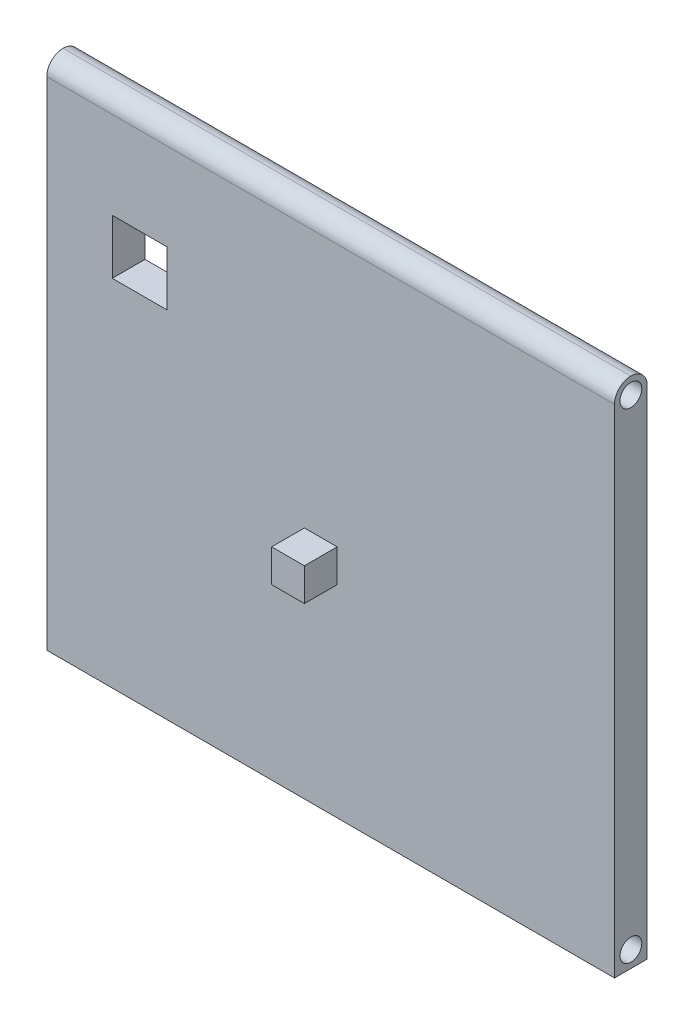
ISO-10303-21;
HEADER;
FILE_DESCRIPTION(('STEP AP214'),'2;1');
FILE_NAME('part.step','',(''),(''),'','','');
FILE_SCHEMA(('AUTOMOTIVE_DESIGN { 1 0 10303 214 1 1 1 1 }'));
ENDSEC;
DATA;
#1=APPLICATION_CONTEXT('core data for automotive mechanical design processes');
#2=APPLICATION_PROTOCOL_DEFINITION('international standard','automotive_design',2000,#1);
#3=PRODUCT_CONTEXT('',#1,'mechanical');
#4=PRODUCT('Part','Part','',(#3));
#5=PRODUCT_RELATED_PRODUCT_CATEGORY('part','',(#4));
#6=PRODUCT_DEFINITION_FORMATION('','',#4);
#7=PRODUCT_DEFINITION_CONTEXT('part definition',#1,'design');
#8=PRODUCT_DEFINITION('design','',#6,#7);
#9=PRODUCT_DEFINITION_SHAPE('','',#8);
#10=(LENGTH_UNIT() NAMED_UNIT(*) SI_UNIT(.MILLI.,.METRE.));
#11=(NAMED_UNIT(*) PLANE_ANGLE_UNIT() SI_UNIT($,.RADIAN.));
#12=(NAMED_UNIT(*) SI_UNIT($,.STERADIAN.) SOLID_ANGLE_UNIT());
#13=UNCERTAINTY_MEASURE_WITH_UNIT(LENGTH_MEASURE(1.E-05),#10,'distance_accuracy_value','');
#14=(GEOMETRIC_REPRESENTATION_CONTEXT(3) GLOBAL_UNCERTAINTY_ASSIGNED_CONTEXT((#13)) GLOBAL_UNIT_ASSIGNED_CONTEXT((#10,
#11,#12)) REPRESENTATION_CONTEXT('',''));
#15=CARTESIAN_POINT('',(0.,0.,0.));
#16=DIRECTION('',(0.,0.,1.));
#17=DIRECTION('',(1.,0.,0.));
#18=AXIS2_PLACEMENT_3D('',#15,#16,#17);
#19=CARTESIAN_POINT('',(0.,0.,3.));
#20=DIRECTION('',(0.,0.,1.));
#21=DIRECTION('',(1.,0.,0.));
#22=AXIS2_PLACEMENT_3D('',#19,#20,#21);
#23=PLANE('',#22);
#24=DIRECTION('',(0.,1.,0.));
#25=VECTOR('',#24,1.);
#26=CARTESIAN_POINT('',(-5.47328244274809,0.,3.));
#27=LINE('',#26,#25);
#28=CARTESIAN_POINT('',(-5.47328244274809,-7.2557251908397,3.));
#29=VERTEX_POINT('',#28);
#30=CARTESIAN_POINT('',(-5.47328244274809,-2.2557251908397,3.));
#31=VERTEX_POINT('',#30);
#32=EDGE_CURVE('E178',#29,#31,#27,.T.);
#33=ORIENTED_EDGE('',*,*,#32,.F.);
#34=DIRECTION('',(1.,0.,0.));
#35=VECTOR('',#34,1.);
#36=CARTESIAN_POINT('',(0.,-7.2557251908397,3.));
#37=LINE('',#36,#35);
#38=CARTESIAN_POINT('',(-10.4732824427481,-7.2557251908397,3.));
#39=VERTEX_POINT('',#38);
#40=EDGE_CURVE('E166',#39,#29,#37,.T.);
#41=ORIENTED_EDGE('',*,*,#40,.F.);
#42=DIRECTION('',(0.,-1.,0.));
#43=VECTOR('',#42,1.);
#44=CARTESIAN_POINT('',(-10.4732824427481,0.,3.));
#45=LINE('',#44,#43);
#46=CARTESIAN_POINT('',(-10.4732824427481,-2.2557251908397,3.));
#47=VERTEX_POINT('',#46);
#48=EDGE_CURVE('E141',#47,#39,#45,.T.);
#49=ORIENTED_EDGE('',*,*,#48,.F.);
#50=DIRECTION('',(-1.,0.,0.));
#51=VECTOR('',#50,1.);
#52=CARTESIAN_POINT('',(0.,-2.2557251908397,3.));
#53=LINE('',#52,#51);
#54=EDGE_CURVE('E175',#31,#47,#53,.T.);
#55=ORIENTED_EDGE('',*,*,#54,.F.);
#56=EDGE_LOOP('',(#33,#41,#49,#55));
#57=FACE_BOUND('',#56,.T.);
#58=DIRECTION('',(0.,1.,0.));
#59=VECTOR('',#58,1.);
#60=CARTESIAN_POINT('',(35.5267175572519,7.2442748091603,3.));
#61=LINE('',#60,#59);
#62=CARTESIAN_POINT('',(35.5267175572519,-39.7557251908397,3.));
#63=VERTEX_POINT('',#62);
#64=CARTESIAN_POINT('',(35.5267175572519,5.7442748091603,3.));
#65=VERTEX_POINT('',#64);
#66=EDGE_CURVE('E246',#63,#65,#61,.T.);
#67=ORIENTED_EDGE('',*,*,#66,.T.);
#68=DIRECTION('',(-1.,0.,0.));
#69=VECTOR('',#68,1.);
#70=CARTESIAN_POINT('',(-16.4732824427481,5.7442748091603,3.));
#71=LINE('',#70,#69);
#72=CARTESIAN_POINT('',(-16.4732824427481,5.7442748091603,3.));
#73=VERTEX_POINT('',#72);
#74=EDGE_CURVE('E279',#65,#73,#71,.T.);
#75=ORIENTED_EDGE('',*,*,#74,.T.);
#76=DIRECTION('',(0.,-1.,0.));
#77=VECTOR('',#76,1.);
#78=CARTESIAN_POINT('',(-16.4732824427481,7.2442748091603,3.));
#79=LINE('',#78,#77);
#80=CARTESIAN_POINT('',(-16.4732824427481,-39.7557251908397,3.));
#81=VERTEX_POINT('',#80);
#82=EDGE_CURVE('E239',#73,#81,#79,.T.);
#83=ORIENTED_EDGE('',*,*,#82,.T.);
#84=DIRECTION('',(1.,0.,0.));
#85=VECTOR('',#84,1.);
#86=CARTESIAN_POINT('',(-16.4732824427481,-39.7557251908397,3.));
#87=LINE('',#86,#85);
#88=EDGE_CURVE('E242',#81,#63,#87,.T.);
#89=ORIENTED_EDGE('',*,*,#88,.T.);
#90=EDGE_LOOP('',(#67,#75,#83,#89));
#91=FACE_BOUND('',#90,.T.);
#92=DIRECTION('',(1.,0.,0.));
#93=VECTOR('',#92,1.);
#94=CARTESIAN_POINT('',(7.12671755725191,-21.2557251908397,3.));
#95=LINE('',#94,#93);
#96=CARTESIAN_POINT('',(7.12671755725191,-21.2557251908397,3.));
#97=VERTEX_POINT('',#96);
#98=CARTESIAN_POINT('',(10.1267175572519,-21.2557251908397,3.));
#99=VERTEX_POINT('',#98);
#100=EDGE_CURVE('E200',#97,#99,#95,.T.);
#101=ORIENTED_EDGE('',*,*,#100,.F.);
#102=DIRECTION('',(0.,-1.,0.));
#103=VECTOR('',#102,1.);
#104=CARTESIAN_POINT('',(7.12671755725191,-18.2557251908397,3.));
#105=LINE('',#104,#103);
#106=CARTESIAN_POINT('',(7.12671755725191,-18.2557251908397,3.));
#107=VERTEX_POINT('',#106);
#108=EDGE_CURVE('E181',#107,#97,#105,.T.);
#109=ORIENTED_EDGE('',*,*,#108,.F.);
#110=DIRECTION('',(-1.,0.,0.));
#111=VECTOR('',#110,1.);
#112=CARTESIAN_POINT('',(7.12671755725191,-18.2557251908397,3.));
#113=LINE('',#112,#111);
#114=CARTESIAN_POINT('',(10.1267175572519,-18.2557251908397,3.));
#115=VERTEX_POINT('',#114);
#116=EDGE_CURVE('E187',#115,#107,#113,.T.);
#117=ORIENTED_EDGE('',*,*,#116,.F.);
#118=DIRECTION('',(0.,1.,0.));
#119=VECTOR('',#118,1.);
#120=CARTESIAN_POINT('',(10.1267175572519,-18.2557251908397,3.));
#121=LINE('',#120,#119);
#122=EDGE_CURVE('E203',#99,#115,#121,.T.);
#123=ORIENTED_EDGE('',*,*,#122,.F.);
#124=EDGE_LOOP('',(#101,#109,#117,#123));
#125=FACE_BOUND('',#124,.T.);
#126=ADVANCED_FACE('F40',(#57,#91,#125),#23,.T.);
#127=CARTESIAN_POINT('',(-16.4732824427481,7.2442748091603,3.));
#128=DIRECTION('',(1.,0.,0.));
#129=DIRECTION('',(0.,1.,0.));
#130=AXIS2_PLACEMENT_3D('',#127,#128,#129);
#131=PLANE('',#130);
#132=CARTESIAN_POINT('',(-16.4732824427481,-38.2557251908397,1.5));
#133=DIRECTION('',(1.,0.,0.));
#134=DIRECTION('',(0.,1.,0.));
#135=AXIS2_PLACEMENT_3D('',#132,#133,#134);
#136=CIRCLE('',#135,1.);
#137=CARTESIAN_POINT('',(-16.4732824427481,-37.2557251908397,1.5));
#138=VERTEX_POINT('',#137);
#139=EDGE_CURVE('E226',#138,#138,#136,.T.);
#140=ORIENTED_EDGE('',*,*,#139,.T.);
#141=EDGE_LOOP('',(#140));
#142=FACE_BOUND('',#141,.T.);
#143=CARTESIAN_POINT('',(-16.4732824427481,5.74427480916029,1.5));
#144=DIRECTION('',(1.,0.,0.));
#145=DIRECTION('',(0.,1.,0.));
#146=AXIS2_PLACEMENT_3D('',#143,#144,#145);
#147=CIRCLE('',#146,1.);
#148=CARTESIAN_POINT('',(-16.4732824427481,6.74427480916029,1.5));
#149=VERTEX_POINT('',#148);
#150=EDGE_CURVE('E234',#149,#149,#147,.T.);
#151=ORIENTED_EDGE('',*,*,#150,.T.);
#152=EDGE_LOOP('',(#151));
#153=FACE_BOUND('',#152,.T.);
#154=ORIENTED_EDGE('',*,*,#82,.F.);
#155=CARTESIAN_POINT('',(-16.4732824427481,5.7442748091603,1.5));
#156=DIRECTION('',(1.,0.,0.));
#157=DIRECTION('',(0.,1.,0.));
#158=AXIS2_PLACEMENT_3D('',#155,#156,#157);
#159=CIRCLE('',#158,1.5);
#160=CARTESIAN_POINT('',(-16.4732824427481,7.2442748091603,1.5));
#161=VERTEX_POINT('',#160);
#162=EDGE_CURVE('E49',#73,#161,#159,.F.);
#163=ORIENTED_EDGE('',*,*,#162,.T.);
#164=CARTESIAN_POINT('',(-16.4732824427481,5.7442748091603,1.5));
#165=DIRECTION('',(1.,0.,0.));
#166=DIRECTION('',(0.,1.,0.));
#167=AXIS2_PLACEMENT_3D('',#164,#165,#166);
#168=CIRCLE('',#167,1.5);
#169=CARTESIAN_POINT('',(-16.4732824427481,5.7442748091603,0.));
#170=VERTEX_POINT('',#169);
#171=EDGE_CURVE('E270',#161,#170,#168,.F.);
#172=ORIENTED_EDGE('',*,*,#171,.T.);
#173=DIRECTION('',(0.,-1.,0.));
#174=VECTOR('',#173,1.);
#175=CARTESIAN_POINT('',(-16.4732824427481,7.2442748091603,0.));
#176=LINE('',#175,#174);
#177=CARTESIAN_POINT('',(-16.4732824427481,-39.7557251908397,0.));
#178=VERTEX_POINT('',#177);
#179=EDGE_CURVE('E238',#170,#178,#176,.T.);
#180=ORIENTED_EDGE('',*,*,#179,.T.);
#181=DIRECTION('',(0.,0.,-1.));
#182=VECTOR('',#181,1.);
#183=CARTESIAN_POINT('',(-16.4732824427481,-39.7557251908397,3.));
#184=LINE('',#183,#182);
#185=EDGE_CURVE('E262',#81,#178,#184,.T.);
#186=ORIENTED_EDGE('',*,*,#185,.F.);
#187=EDGE_LOOP('',(#154,#163,#172,#180,#186));
#188=FACE_BOUND('',#187,.T.);
#189=ADVANCED_FACE('F286',(#142,#153,#188),#131,.F.);
#190=CARTESIAN_POINT('',(-16.4732824427481,-39.7557251908397,3.));
#191=DIRECTION('',(0.,1.,0.));
#192=DIRECTION('',(0.,0.,1.));
#193=AXIS2_PLACEMENT_3D('',#190,#191,#192);
#194=PLANE('',#193);
#195=DIRECTION('',(1.,0.,0.));
#196=VECTOR('',#195,1.);
#197=CARTESIAN_POINT('',(-16.4732824427481,-39.7557251908397,0.));
#198=LINE('',#197,#196);
#199=CARTESIAN_POINT('',(35.5267175572519,-39.7557251908397,0.));
#200=VERTEX_POINT('',#199);
#201=EDGE_CURVE('E253',#178,#200,#198,.T.);
#202=ORIENTED_EDGE('',*,*,#201,.T.);
#203=DIRECTION('',(0.,0.,-1.));
#204=VECTOR('',#203,1.);
#205=CARTESIAN_POINT('',(35.5267175572519,-39.7557251908397,3.));
#206=LINE('',#205,#204);
#207=EDGE_CURVE('E250',#63,#200,#206,.T.);
#208=ORIENTED_EDGE('',*,*,#207,.F.);
#209=ORIENTED_EDGE('',*,*,#88,.F.);
#210=ORIENTED_EDGE('',*,*,#185,.T.);
#211=EDGE_LOOP('',(#202,#208,#209,#210));
#212=FACE_BOUND('',#211,.T.);
#213=ADVANCED_FACE('F305',(#212),#194,.F.);
#214=CARTESIAN_POINT('',(35.5267175572519,7.2442748091603,3.));
#215=DIRECTION('',(-1.,0.,0.));
#216=DIRECTION('',(0.,-1.,0.));
#217=AXIS2_PLACEMENT_3D('',#214,#215,#216);
#218=PLANE('',#217);
#219=CARTESIAN_POINT('',(35.5267175572519,-38.2557251908397,1.5));
#220=DIRECTION('',(1.,0.,0.));
#221=DIRECTION('',(0.,1.,0.));
#222=AXIS2_PLACEMENT_3D('',#219,#220,#221);
#223=CIRCLE('',#222,1.);
#224=CARTESIAN_POINT('',(35.5267175572519,-37.2557251908397,1.5));
#225=VERTEX_POINT('',#224);
#226=EDGE_CURVE('E222',#225,#225,#223,.T.);
#227=ORIENTED_EDGE('',*,*,#226,.F.);
#228=EDGE_LOOP('',(#227));
#229=FACE_BOUND('',#228,.T.);
#230=CARTESIAN_POINT('',(35.5267175572519,5.7442748091603,1.5));
#231=DIRECTION('',(1.,0.,0.));
#232=DIRECTION('',(0.,1.,0.));
#233=AXIS2_PLACEMENT_3D('',#230,#231,#232);
#234=CIRCLE('',#233,1.);
#235=CARTESIAN_POINT('',(35.5267175572519,6.7442748091603,1.5));
#236=VERTEX_POINT('',#235);
#237=EDGE_CURVE('E230',#236,#236,#234,.T.);
#238=ORIENTED_EDGE('',*,*,#237,.F.);
#239=EDGE_LOOP('',(#238));
#240=FACE_BOUND('',#239,.T.);
#241=CARTESIAN_POINT('',(35.5267175572519,5.7442748091603,1.5));
#242=DIRECTION('',(-1.,0.,0.));
#243=DIRECTION('',(0.,-1.,0.));
#244=AXIS2_PLACEMENT_3D('',#241,#242,#243);
#245=CIRCLE('',#244,1.5);
#246=CARTESIAN_POINT('',(35.5267175572519,5.7442748091603,0.));
#247=VERTEX_POINT('',#246);
#248=CARTESIAN_POINT('',(35.5267175572519,7.2442748091603,1.5));
#249=VERTEX_POINT('',#248);
#250=EDGE_CURVE('E276',#247,#249,#245,.F.);
#251=ORIENTED_EDGE('',*,*,#250,.T.);
#252=CARTESIAN_POINT('',(35.5267175572519,5.7442748091603,1.5));
#253=DIRECTION('',(-1.,0.,0.));
#254=DIRECTION('',(0.,-1.,0.));
#255=AXIS2_PLACEMENT_3D('',#252,#253,#254);
#256=CIRCLE('',#255,1.5);
#257=EDGE_CURVE('E11',#249,#65,#256,.F.);
#258=ORIENTED_EDGE('',*,*,#257,.T.);
#259=ORIENTED_EDGE('',*,*,#66,.F.);
#260=ORIENTED_EDGE('',*,*,#207,.T.);
#261=DIRECTION('',(0.,1.,0.));
#262=VECTOR('',#261,1.);
#263=CARTESIAN_POINT('',(35.5267175572519,7.2442748091603,0.));
#264=LINE('',#263,#262);
#265=EDGE_CURVE('E243',#200,#247,#264,.T.);
#266=ORIENTED_EDGE('',*,*,#265,.T.);
#267=EDGE_LOOP('',(#251,#258,#259,#260,#266));
#268=FACE_BOUND('',#267,.T.);
#269=ADVANCED_FACE('F299',(#229,#240,#268),#218,.F.);
#270=CARTESIAN_POINT('',(0.,0.,0.));
#271=DIRECTION('',(0.,0.,1.));
#272=DIRECTION('',(1.,0.,0.));
#273=AXIS2_PLACEMENT_3D('',#270,#271,#272);
#274=PLANE('',#273);
#275=DIRECTION('',(-1.,0.,0.));
#276=VECTOR('',#275,1.);
#277=CARTESIAN_POINT('',(-5.47328244274809,-7.2557251908397,0.));
#278=LINE('',#277,#276);
#279=CARTESIAN_POINT('',(-5.47328244274809,-7.2557251908397,0.));
#280=VERTEX_POINT('',#279);
#281=CARTESIAN_POINT('',(-10.4732824427481,-7.2557251908397,0.));
#282=VERTEX_POINT('',#281);
#283=EDGE_CURVE('E148',#280,#282,#278,.T.);
#284=ORIENTED_EDGE('',*,*,#283,.F.);
#285=DIRECTION('',(0.,-1.,0.));
#286=VECTOR('',#285,1.);
#287=CARTESIAN_POINT('',(-5.47328244274809,-2.2557251908397,0.));
#288=LINE('',#287,#286);
#289=CARTESIAN_POINT('',(-5.47328244274809,-2.2557251908397,0.));
#290=VERTEX_POINT('',#289);
#291=EDGE_CURVE('E64',#290,#280,#288,.T.);
#292=ORIENTED_EDGE('',*,*,#291,.F.);
#293=DIRECTION('',(1.,0.,0.));
#294=VECTOR('',#293,1.);
#295=CARTESIAN_POINT('',(-5.47328244274809,-2.2557251908397,0.));
#296=LINE('',#295,#294);
#297=CARTESIAN_POINT('',(-10.4732824427481,-2.2557251908397,0.));
#298=VERTEX_POINT('',#297);
#299=EDGE_CURVE('E156',#298,#290,#296,.T.);
#300=ORIENTED_EDGE('',*,*,#299,.F.);
#301=DIRECTION('',(0.,1.,0.));
#302=VECTOR('',#301,1.);
#303=CARTESIAN_POINT('',(-10.4732824427481,-2.2557251908397,0.));
#304=LINE('',#303,#302);
#305=EDGE_CURVE('E138',#282,#298,#304,.T.);
#306=ORIENTED_EDGE('',*,*,#305,.F.);
#307=EDGE_LOOP('',(#284,#292,#300,#306));
#308=FACE_BOUND('',#307,.T.);
#309=ORIENTED_EDGE('',*,*,#179,.F.);
#310=DIRECTION('',(-1.,0.,0.));
#311=VECTOR('',#310,1.);
#312=CARTESIAN_POINT('',(0.,5.7442748091603,0.));
#313=LINE('',#312,#311);
#314=EDGE_CURVE('E273',#170,#247,#313,.F.);
#315=ORIENTED_EDGE('',*,*,#314,.T.);
#316=ORIENTED_EDGE('',*,*,#265,.F.);
#317=ORIENTED_EDGE('',*,*,#201,.F.);
#318=EDGE_LOOP('',(#309,#315,#316,#317));
#319=FACE_BOUND('',#318,.T.);
#320=ADVANCED_FACE('F153',(#308,#319),#274,.F.);
#321=CARTESIAN_POINT('',(-56.4732824427481,5.74427480916029,1.5));
#322=DIRECTION('',(1.,0.,0.));
#323=DIRECTION('',(0.,1.,0.));
#324=AXIS2_PLACEMENT_3D('',#321,#322,#323);
#325=CYLINDRICAL_SURFACE('',#324,1.);
#326=ORIENTED_EDGE('',*,*,#237,.T.);
#327=EDGE_LOOP('',(#326));
#328=FACE_BOUND('',#327,.T.);
#329=ORIENTED_EDGE('',*,*,#150,.F.);
#330=EDGE_LOOP('',(#329));
#331=FACE_BOUND('',#330,.T.);
#332=ADVANCED_FACE('F309',(#328,#331),#325,.F.);
#333=CARTESIAN_POINT('',(-16.4732824427481,5.7442748091603,1.5));
#334=DIRECTION('',(-1.,0.,0.));
#335=DIRECTION('',(0.,0.,1.));
#336=AXIS2_PLACEMENT_3D('',#333,#334,#335);
#337=CYLINDRICAL_SURFACE('',#336,1.5);
#338=ORIENTED_EDGE('',*,*,#250,.F.);
#339=ORIENTED_EDGE('',*,*,#314,.F.);
#340=ORIENTED_EDGE('',*,*,#171,.F.);
#341=DIRECTION('',(-1.,0.,0.));
#342=VECTOR('',#341,1.);
#343=CARTESIAN_POINT('',(-16.4732824427481,7.2442748091603,1.5));
#344=LINE('',#343,#342);
#345=EDGE_CURVE('E266',#249,#161,#344,.T.);
#346=ORIENTED_EDGE('',*,*,#345,.F.);
#347=EDGE_LOOP('',(#338,#339,#340,#346));
#348=FACE_BOUND('',#347,.T.);
#349=ADVANCED_FACE('F295',(#348),#337,.T.);
#350=CARTESIAN_POINT('',(0.,5.7442748091603,1.5));
#351=DIRECTION('',(1.,0.,0.));
#352=DIRECTION('',(0.,0.,-1.));
#353=AXIS2_PLACEMENT_3D('',#350,#351,#352);
#354=CYLINDRICAL_SURFACE('',#353,1.5);
#355=ORIENTED_EDGE('',*,*,#257,.F.);
#356=ORIENTED_EDGE('',*,*,#345,.T.);
#357=ORIENTED_EDGE('',*,*,#162,.F.);
#358=ORIENTED_EDGE('',*,*,#74,.F.);
#359=EDGE_LOOP('',(#355,#356,#357,#358));
#360=FACE_BOUND('',#359,.T.);
#361=ADVANCED_FACE('F42',(#360),#354,.T.);
#362=CARTESIAN_POINT('',(-56.4732824427481,-38.2557251908397,1.5));
#363=DIRECTION('',(1.,0.,0.));
#364=DIRECTION('',(0.,1.,0.));
#365=AXIS2_PLACEMENT_3D('',#362,#363,#364);
#366=CYLINDRICAL_SURFACE('',#365,1.);
#367=ORIENTED_EDGE('',*,*,#226,.T.);
#368=EDGE_LOOP('',(#367));
#369=FACE_BOUND('',#368,.T.);
#370=ORIENTED_EDGE('',*,*,#139,.F.);
#371=EDGE_LOOP('',(#370));
#372=FACE_BOUND('',#371,.T.);
#373=ADVANCED_FACE('F331',(#369,#372),#366,.F.);
#374=CARTESIAN_POINT('',(7.12671755725191,-18.2557251908397,6.));
#375=DIRECTION('',(1.,0.,0.));
#376=DIRECTION('',(0.,1.,0.));
#377=AXIS2_PLACEMENT_3D('',#374,#375,#376);
#378=PLANE('',#377);
#379=ORIENTED_EDGE('',*,*,#108,.T.);
#380=DIRECTION('',(0.,0.,-1.));
#381=VECTOR('',#380,1.);
#382=CARTESIAN_POINT('',(7.12671755725191,-21.2557251908397,6.));
#383=LINE('',#382,#381);
#384=CARTESIAN_POINT('',(7.12671755725191,-21.2557251908397,6.));
#385=VERTEX_POINT('',#384);
#386=EDGE_CURVE('E219',#385,#97,#383,.T.);
#387=ORIENTED_EDGE('',*,*,#386,.F.);
#388=DIRECTION('',(0.,-1.,0.));
#389=VECTOR('',#388,1.);
#390=CARTESIAN_POINT('',(7.12671755725191,-18.2557251908397,6.));
#391=LINE('',#390,#389);
#392=CARTESIAN_POINT('',(7.12671755725191,-18.2557251908397,6.));
#393=VERTEX_POINT('',#392);
#394=EDGE_CURVE('E182',#393,#385,#391,.T.);
#395=ORIENTED_EDGE('',*,*,#394,.F.);
#396=DIRECTION('',(0.,0.,-1.));
#397=VECTOR('',#396,1.);
#398=CARTESIAN_POINT('',(7.12671755725191,-18.2557251908397,6.));
#399=LINE('',#398,#397);
#400=EDGE_CURVE('E196',#393,#107,#399,.T.);
#401=ORIENTED_EDGE('',*,*,#400,.T.);
#402=EDGE_LOOP('',(#379,#387,#395,#401));
#403=FACE_BOUND('',#402,.T.);
#404=ADVANCED_FACE('F334',(#403),#378,.F.);
#405=CARTESIAN_POINT('',(7.12671755725191,-21.2557251908397,6.));
#406=DIRECTION('',(0.,1.,0.));
#407=DIRECTION('',(0.,0.,1.));
#408=AXIS2_PLACEMENT_3D('',#405,#406,#407);
#409=PLANE('',#408);
#410=ORIENTED_EDGE('',*,*,#100,.T.);
#411=DIRECTION('',(0.,0.,-1.));
#412=VECTOR('',#411,1.);
#413=CARTESIAN_POINT('',(10.1267175572519,-21.2557251908397,6.));
#414=LINE('',#413,#412);
#415=CARTESIAN_POINT('',(10.1267175572519,-21.2557251908397,6.));
#416=VERTEX_POINT('',#415);
#417=EDGE_CURVE('E215',#416,#99,#414,.T.);
#418=ORIENTED_EDGE('',*,*,#417,.F.);
#419=DIRECTION('',(1.,0.,0.));
#420=VECTOR('',#419,1.);
#421=CARTESIAN_POINT('',(7.12671755725191,-21.2557251908397,6.));
#422=LINE('',#421,#420);
#423=EDGE_CURVE('E186',#385,#416,#422,.T.);
#424=ORIENTED_EDGE('',*,*,#423,.F.);
#425=ORIENTED_EDGE('',*,*,#386,.T.);
#426=EDGE_LOOP('',(#410,#418,#424,#425));
#427=FACE_BOUND('',#426,.T.);
#428=ADVANCED_FACE('F338',(#427),#409,.F.);
#429=CARTESIAN_POINT('',(10.1267175572519,-18.2557251908397,6.));
#430=DIRECTION('',(-1.,0.,0.));
#431=DIRECTION('',(0.,-1.,0.));
#432=AXIS2_PLACEMENT_3D('',#429,#430,#431);
#433=PLANE('',#432);
#434=ORIENTED_EDGE('',*,*,#122,.T.);
#435=DIRECTION('',(0.,0.,-1.));
#436=VECTOR('',#435,1.);
#437=CARTESIAN_POINT('',(10.1267175572519,-18.2557251908397,6.));
#438=LINE('',#437,#436);
#439=CARTESIAN_POINT('',(10.1267175572519,-18.2557251908397,6.));
#440=VERTEX_POINT('',#439);
#441=EDGE_CURVE('E212',#440,#115,#438,.T.);
#442=ORIENTED_EDGE('',*,*,#441,.F.);
#443=DIRECTION('',(0.,1.,0.));
#444=VECTOR('',#443,1.);
#445=CARTESIAN_POINT('',(10.1267175572519,-18.2557251908397,6.));
#446=LINE('',#445,#444);
#447=EDGE_CURVE('E190',#416,#440,#446,.T.);
#448=ORIENTED_EDGE('',*,*,#447,.F.);
#449=ORIENTED_EDGE('',*,*,#417,.T.);
#450=EDGE_LOOP('',(#434,#442,#448,#449));
#451=FACE_BOUND('',#450,.T.);
#452=ADVANCED_FACE('F342',(#451),#433,.F.);
#453=CARTESIAN_POINT('',(7.12671755725191,-18.2557251908397,6.));
#454=DIRECTION('',(0.,-1.,0.));
#455=DIRECTION('',(1.,0.,0.));
#456=AXIS2_PLACEMENT_3D('',#453,#454,#455);
#457=PLANE('',#456);
#458=ORIENTED_EDGE('',*,*,#116,.T.);
#459=ORIENTED_EDGE('',*,*,#400,.F.);
#460=DIRECTION('',(-1.,0.,0.));
#461=VECTOR('',#460,1.);
#462=CARTESIAN_POINT('',(7.12671755725191,-18.2557251908397,6.));
#463=LINE('',#462,#461);
#464=EDGE_CURVE('E193',#440,#393,#463,.T.);
#465=ORIENTED_EDGE('',*,*,#464,.F.);
#466=ORIENTED_EDGE('',*,*,#441,.T.);
#467=EDGE_LOOP('',(#458,#459,#465,#466));
#468=FACE_BOUND('',#467,.T.);
#469=ADVANCED_FACE('F346',(#468),#457,.F.);
#470=CARTESIAN_POINT('',(0.,0.,6.));
#471=DIRECTION('',(0.,0.,1.));
#472=DIRECTION('',(1.,0.,0.));
#473=AXIS2_PLACEMENT_3D('',#470,#471,#472);
#474=PLANE('',#473);
#475=ORIENTED_EDGE('',*,*,#394,.T.);
#476=ORIENTED_EDGE('',*,*,#423,.T.);
#477=ORIENTED_EDGE('',*,*,#447,.T.);
#478=ORIENTED_EDGE('',*,*,#464,.T.);
#479=EDGE_LOOP('',(#475,#476,#477,#478));
#480=FACE_BOUND('',#479,.T.);
#481=ADVANCED_FACE('F350',(#480),#474,.T.);
#482=CARTESIAN_POINT('',(-5.47328244274809,-2.2557251908397,6.));
#483=DIRECTION('',(1.,0.,0.));
#484=DIRECTION('',(0.,1.,0.));
#485=AXIS2_PLACEMENT_3D('',#482,#483,#484);
#486=PLANE('',#485);
#487=ORIENTED_EDGE('',*,*,#32,.T.);
#488=DIRECTION('',(0.,0.,-1.));
#489=VECTOR('',#488,1.);
#490=CARTESIAN_POINT('',(-5.47328244274809,-2.2557251908397,6.));
#491=LINE('',#490,#489);
#492=EDGE_CURVE('E163',#31,#290,#491,.T.);
#493=ORIENTED_EDGE('',*,*,#492,.T.);
#494=ORIENTED_EDGE('',*,*,#291,.T.);
#495=DIRECTION('',(0.,0.,-1.));
#496=VECTOR('',#495,1.);
#497=CARTESIAN_POINT('',(-5.47328244274809,-7.2557251908397,6.));
#498=LINE('',#497,#496);
#499=EDGE_CURVE('E145',#29,#280,#498,.T.);
#500=ORIENTED_EDGE('',*,*,#499,.F.);
#501=EDGE_LOOP('',(#487,#493,#494,#500));
#502=FACE_BOUND('',#501,.T.);
#503=ADVANCED_FACE('F354',(#502),#486,.F.);
#504=CARTESIAN_POINT('',(-5.47328244274809,-2.2557251908397,6.));
#505=DIRECTION('',(0.,1.,0.));
#506=DIRECTION('',(-1.,0.,0.));
#507=AXIS2_PLACEMENT_3D('',#504,#505,#506);
#508=PLANE('',#507);
#509=ORIENTED_EDGE('',*,*,#54,.T.);
#510=DIRECTION('',(0.,0.,-1.));
#511=VECTOR('',#510,1.);
#512=CARTESIAN_POINT('',(-10.4732824427481,-2.2557251908397,6.));
#513=LINE('',#512,#511);
#514=EDGE_CURVE('E144',#47,#298,#513,.T.);
#515=ORIENTED_EDGE('',*,*,#514,.T.);
#516=ORIENTED_EDGE('',*,*,#299,.T.);
#517=ORIENTED_EDGE('',*,*,#492,.F.);
#518=EDGE_LOOP('',(#509,#515,#516,#517));
#519=FACE_BOUND('',#518,.T.);
#520=ADVANCED_FACE('F358',(#519),#508,.F.);
#521=CARTESIAN_POINT('',(-10.4732824427481,-2.2557251908397,6.));
#522=DIRECTION('',(-1.,0.,0.));
#523=DIRECTION('',(0.,-1.,0.));
#524=AXIS2_PLACEMENT_3D('',#521,#522,#523);
#525=PLANE('',#524);
#526=ORIENTED_EDGE('',*,*,#48,.T.);
#527=DIRECTION('',(0.,0.,-1.));
#528=VECTOR('',#527,1.);
#529=CARTESIAN_POINT('',(-10.4732824427481,-7.2557251908397,6.));
#530=LINE('',#529,#528);
#531=EDGE_CURVE('E56',#39,#282,#530,.T.);
#532=ORIENTED_EDGE('',*,*,#531,.T.);
#533=ORIENTED_EDGE('',*,*,#305,.T.);
#534=ORIENTED_EDGE('',*,*,#514,.F.);
#535=EDGE_LOOP('',(#526,#532,#533,#534));
#536=FACE_BOUND('',#535,.T.);
#537=ADVANCED_FACE('F135',(#536),#525,.F.);
#538=CARTESIAN_POINT('',(-5.47328244274809,-7.2557251908397,6.));
#539=DIRECTION('',(0.,-1.,0.));
#540=DIRECTION('',(0.,0.,-1.));
#541=AXIS2_PLACEMENT_3D('',#538,#539,#540);
#542=PLANE('',#541);
#543=ORIENTED_EDGE('',*,*,#40,.T.);
#544=ORIENTED_EDGE('',*,*,#499,.T.);
#545=ORIENTED_EDGE('',*,*,#283,.T.);
#546=ORIENTED_EDGE('',*,*,#531,.F.);
#547=EDGE_LOOP('',(#543,#544,#545,#546));
#548=FACE_BOUND('',#547,.T.);
#549=ADVANCED_FACE('F149',(#548),#542,.F.);
#550=CLOSED_SHELL('',(#126,#189,#213,#269,#320,#332,#349,#361,#373,#404,#428,#452,#469,#481,
#503,#520,#537,#549));
#551=MANIFOLD_SOLID_BREP('B2',#550);
#552=ADVANCED_BREP_SHAPE_REPRESENTATION('',(#18,#551),#14);
#553=SHAPE_DEFINITION_REPRESENTATION(#9,#552);
ENDSEC;
END-ISO-10303-21;
